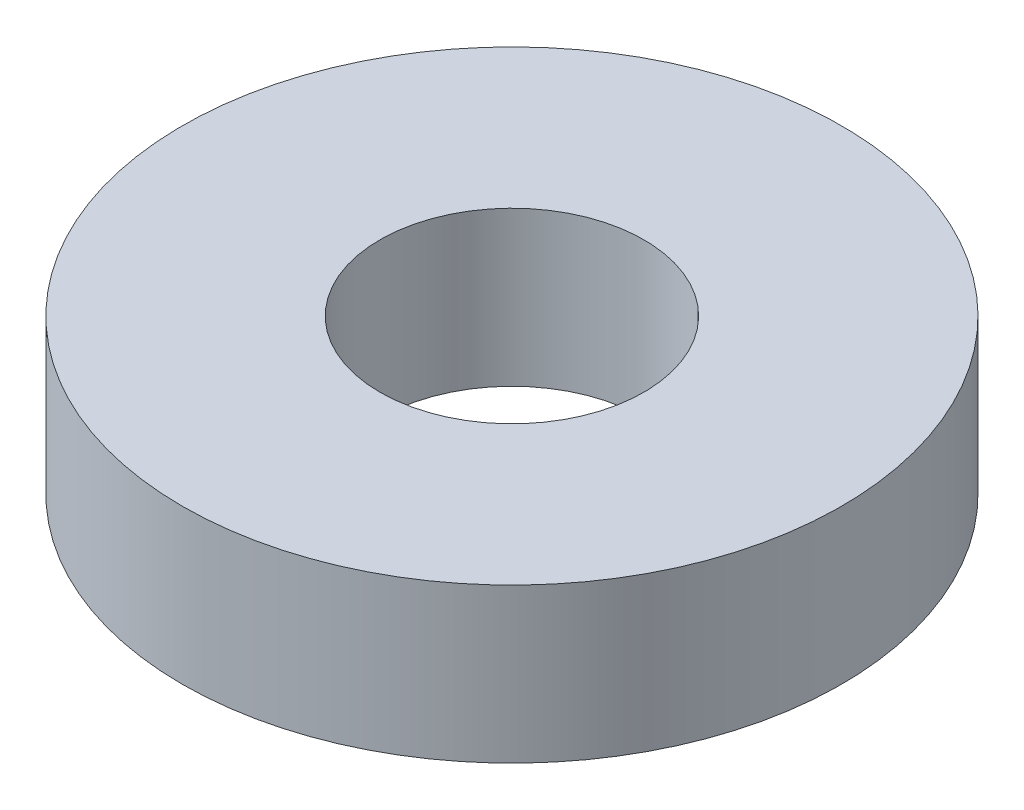
ISO-10303-21;
HEADER;
FILE_DESCRIPTION(('STEP AP214'),'2;1');
FILE_NAME('part.step','',(''),(''),'','','');
FILE_SCHEMA(('AUTOMOTIVE_DESIGN { 1 0 10303 214 1 1 1 1 }'));
ENDSEC;
DATA;
#1=APPLICATION_CONTEXT('core data for automotive mechanical design processes');
#2=APPLICATION_PROTOCOL_DEFINITION('international standard','automotive_design',2000,#1);
#3=PRODUCT_CONTEXT('',#1,'mechanical');
#4=PRODUCT('Part','Part','',(#3));
#5=PRODUCT_RELATED_PRODUCT_CATEGORY('part','',(#4));
#6=PRODUCT_DEFINITION_FORMATION('','',#4);
#7=PRODUCT_DEFINITION_CONTEXT('part definition',#1,'design');
#8=PRODUCT_DEFINITION('design','',#6,#7);
#9=PRODUCT_DEFINITION_SHAPE('','',#8);
#10=(LENGTH_UNIT() NAMED_UNIT(*) SI_UNIT(.MILLI.,.METRE.));
#11=(NAMED_UNIT(*) PLANE_ANGLE_UNIT() SI_UNIT($,.RADIAN.));
#12=(NAMED_UNIT(*) SI_UNIT($,.STERADIAN.) SOLID_ANGLE_UNIT());
#13=UNCERTAINTY_MEASURE_WITH_UNIT(LENGTH_MEASURE(1.E-05),#10,'distance_accuracy_value','');
#14=(GEOMETRIC_REPRESENTATION_CONTEXT(3) GLOBAL_UNCERTAINTY_ASSIGNED_CONTEXT((#13)) GLOBAL_UNIT_ASSIGNED_CONTEXT((#10,
#11,#12)) REPRESENTATION_CONTEXT('',''));
#15=CARTESIAN_POINT('',(0.,0.,0.));
#16=DIRECTION('',(0.,0.,1.));
#17=DIRECTION('',(1.,0.,0.));
#18=AXIS2_PLACEMENT_3D('',#15,#16,#17);
#19=CARTESIAN_POINT('',(0.,1.8542,0.));
#20=DIRECTION('',(0.,-1.,0.));
#21=DIRECTION('',(0.,0.,-1.));
#22=AXIS2_PLACEMENT_3D('',#19,#20,#21);
#23=CYLINDRICAL_SURFACE('',#22,3.9624);
#24=CARTESIAN_POINT('',(0.,1.8542,0.));
#25=DIRECTION('',(0.,1.,0.));
#26=DIRECTION('',(0.,0.,1.));
#27=AXIS2_PLACEMENT_3D('',#24,#25,#26);
#28=CIRCLE('',#27,3.9624);
#29=CARTESIAN_POINT('',(0.,1.8542,3.9624));
#30=VERTEX_POINT('',#29);
#31=EDGE_CURVE('E10',#30,#30,#28,.T.);
#32=ORIENTED_EDGE('',*,*,#31,.F.);
#33=EDGE_LOOP('',(#32));
#34=FACE_BOUND('',#33,.T.);
#35=CARTESIAN_POINT('',(0.,0.,0.));
#36=DIRECTION('',(0.,1.,0.));
#37=DIRECTION('',(0.,0.,1.));
#38=AXIS2_PLACEMENT_3D('',#35,#36,#37);
#39=CIRCLE('',#38,3.9624);
#40=CARTESIAN_POINT('',(0.,0.,3.9624));
#41=VERTEX_POINT('',#40);
#42=EDGE_CURVE('E33',#41,#41,#39,.T.);
#43=ORIENTED_EDGE('',*,*,#42,.T.);
#44=EDGE_LOOP('',(#43));
#45=FACE_BOUND('',#44,.T.);
#46=ADVANCED_FACE('F30',(#34,#45),#23,.T.);
#47=CARTESIAN_POINT('',(0.,1.8542,0.));
#48=DIRECTION('',(0.,1.,0.));
#49=DIRECTION('',(0.,0.,1.));
#50=AXIS2_PLACEMENT_3D('',#47,#48,#49);
#51=PLANE('',#50);
#52=CARTESIAN_POINT('',(0.,1.8542,0.));
#53=DIRECTION('',(0.,1.,0.));
#54=DIRECTION('',(0.,0.,1.));
#55=AXIS2_PLACEMENT_3D('',#52,#53,#54);
#56=CIRCLE('',#55,1.5875);
#57=CARTESIAN_POINT('',(0.,1.8542,1.5875));
#58=VERTEX_POINT('',#57);
#59=EDGE_CURVE('E42',#58,#58,#56,.T.);
#60=ORIENTED_EDGE('',*,*,#59,.F.);
#61=EDGE_LOOP('',(#60));
#62=FACE_BOUND('',#61,.T.);
#63=ORIENTED_EDGE('',*,*,#31,.T.);
#64=EDGE_LOOP('',(#63));
#65=FACE_BOUND('',#64,.T.);
#66=ADVANCED_FACE('F57',(#62,#65),#51,.T.);
#67=CARTESIAN_POINT('',(0.,0.,0.));
#68=DIRECTION('',(0.,1.,0.));
#69=DIRECTION('',(0.,0.,1.));
#70=AXIS2_PLACEMENT_3D('',#67,#68,#69);
#71=PLANE('',#70);
#72=CARTESIAN_POINT('',(0.,0.,0.));
#73=DIRECTION('',(0.,1.,0.));
#74=DIRECTION('',(0.,0.,1.));
#75=AXIS2_PLACEMENT_3D('',#72,#73,#74);
#76=CIRCLE('',#75,1.5875);
#77=CARTESIAN_POINT('',(0.,0.,1.5875));
#78=VERTEX_POINT('',#77);
#79=EDGE_CURVE('E40',#78,#78,#76,.T.);
#80=ORIENTED_EDGE('',*,*,#79,.T.);
#81=EDGE_LOOP('',(#80));
#82=FACE_BOUND('',#81,.T.);
#83=ORIENTED_EDGE('',*,*,#42,.F.);
#84=EDGE_LOOP('',(#83));
#85=FACE_BOUND('',#84,.T.);
#86=ADVANCED_FACE('F48',(#82,#85),#71,.F.);
#87=CARTESIAN_POINT('',(0.,0.,0.));
#88=DIRECTION('',(0.,1.,0.));
#89=DIRECTION('',(0.,0.,1.));
#90=AXIS2_PLACEMENT_3D('',#87,#88,#89);
#91=CYLINDRICAL_SURFACE('',#90,1.5875);
#92=ORIENTED_EDGE('',*,*,#79,.F.);
#93=EDGE_LOOP('',(#92));
#94=FACE_BOUND('',#93,.T.);
#95=ORIENTED_EDGE('',*,*,#59,.T.);
#96=EDGE_LOOP('',(#95));
#97=FACE_BOUND('',#96,.T.);
#98=ADVANCED_FACE('F51',(#94,#97),#91,.F.);
#99=CLOSED_SHELL('',(#46,#66,#86,#98));
#100=MANIFOLD_SOLID_BREP('B2',#99);
#101=ADVANCED_BREP_SHAPE_REPRESENTATION('',(#18,#100),#14);
#102=SHAPE_DEFINITION_REPRESENTATION(#9,#101);
ENDSEC;
END-ISO-10303-21;
